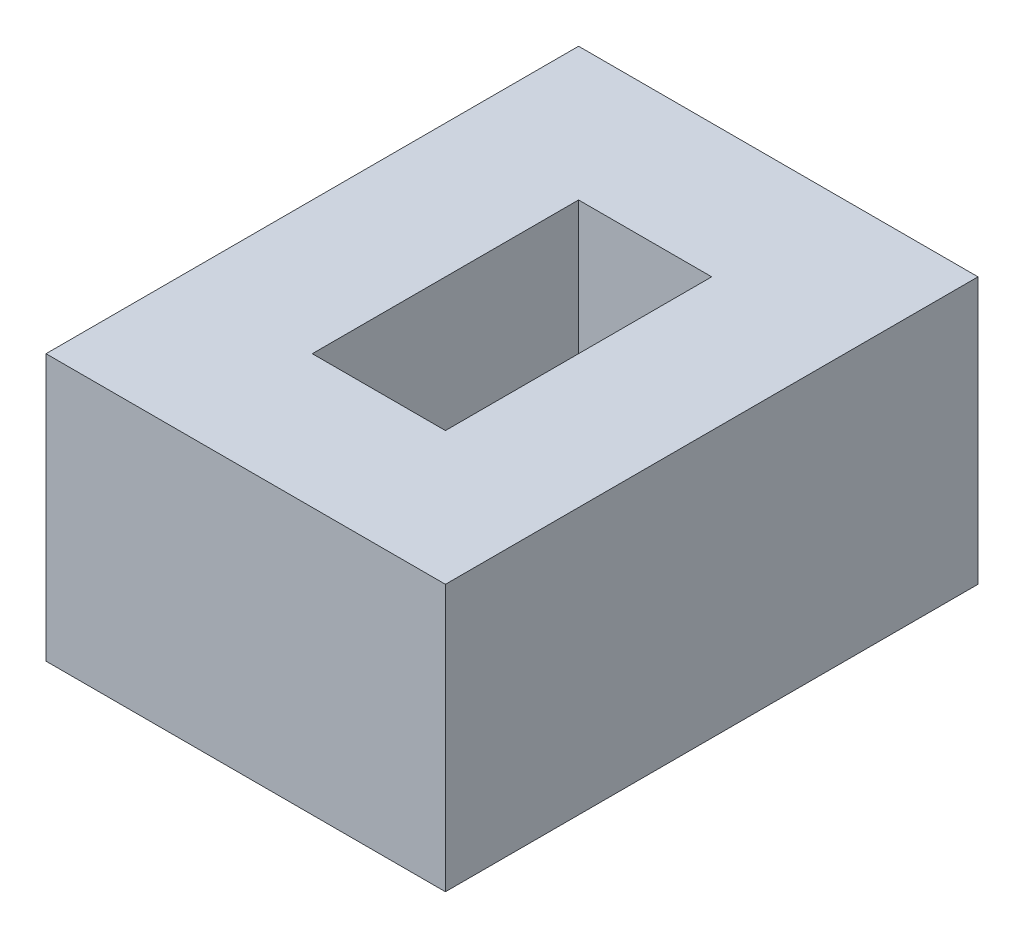
ISO-10303-21;
HEADER;
FILE_DESCRIPTION(('STEP AP214'),'2;1');
FILE_NAME('part.step','',(''),(''),'','','');
FILE_SCHEMA(('AUTOMOTIVE_DESIGN { 1 0 10303 214 1 1 1 1 }'));
ENDSEC;
DATA;
#1=APPLICATION_CONTEXT('core data for automotive mechanical design processes');
#2=APPLICATION_PROTOCOL_DEFINITION('international standard','automotive_design',2000,#1);
#3=PRODUCT_CONTEXT('',#1,'mechanical');
#4=PRODUCT('Part','Part','',(#3));
#5=PRODUCT_RELATED_PRODUCT_CATEGORY('part','',(#4));
#6=PRODUCT_DEFINITION_FORMATION('','',#4);
#7=PRODUCT_DEFINITION_CONTEXT('part definition',#1,'design');
#8=PRODUCT_DEFINITION('design','',#6,#7);
#9=PRODUCT_DEFINITION_SHAPE('','',#8);
#10=(LENGTH_UNIT() NAMED_UNIT(*) SI_UNIT(.MILLI.,.METRE.));
#11=(NAMED_UNIT(*) PLANE_ANGLE_UNIT() SI_UNIT($,.RADIAN.));
#12=(NAMED_UNIT(*) SI_UNIT($,.STERADIAN.) SOLID_ANGLE_UNIT());
#13=UNCERTAINTY_MEASURE_WITH_UNIT(LENGTH_MEASURE(1.E-05),#10,'distance_accuracy_value','');
#14=(GEOMETRIC_REPRESENTATION_CONTEXT(3) GLOBAL_UNCERTAINTY_ASSIGNED_CONTEXT((#13)) GLOBAL_UNIT_ASSIGNED_CONTEXT((#10,
#11,#12)) REPRESENTATION_CONTEXT('',''));
#15=CARTESIAN_POINT('',(0.,0.,0.));
#16=DIRECTION('',(0.,0.,1.));
#17=DIRECTION('',(1.,0.,0.));
#18=AXIS2_PLACEMENT_3D('',#15,#16,#17);
#19=CARTESIAN_POINT('',(0.,10.,0.));
#20=DIRECTION('',(0.,-1.,0.));
#21=DIRECTION('',(0.,0.,-1.));
#22=AXIS2_PLACEMENT_3D('',#19,#20,#21);
#23=PLANE('',#22);
#24=DIRECTION('',(-1.,0.,0.));
#25=VECTOR('',#24,1.);
#26=CARTESIAN_POINT('',(-5.,10.,-5.));
#27=LINE('',#26,#25);
#28=CARTESIAN_POINT('',(10.,10.,-5.));
#29=VERTEX_POINT('',#28);
#30=CARTESIAN_POINT('',(-5.,10.,-5.));
#31=VERTEX_POINT('',#30);
#32=EDGE_CURVE('E136',#29,#31,#27,.T.);
#33=ORIENTED_EDGE('',*,*,#32,.T.);
#34=DIRECTION('',(0.,0.,1.));
#35=VECTOR('',#34,1.);
#36=CARTESIAN_POINT('',(-5.,10.,-5.));
#37=LINE('',#36,#35);
#38=CARTESIAN_POINT('',(-5.,10.,15.));
#39=VERTEX_POINT('',#38);
#40=EDGE_CURVE('E139',#31,#39,#37,.T.);
#41=ORIENTED_EDGE('',*,*,#40,.T.);
#42=DIRECTION('',(1.,0.,0.));
#43=VECTOR('',#42,1.);
#44=CARTESIAN_POINT('',(-5.,10.,15.));
#45=LINE('',#44,#43);
#46=CARTESIAN_POINT('',(10.,10.,15.));
#47=VERTEX_POINT('',#46);
#48=EDGE_CURVE('E142',#39,#47,#45,.T.);
#49=ORIENTED_EDGE('',*,*,#48,.T.);
#50=DIRECTION('',(0.,0.,-1.));
#51=VECTOR('',#50,1.);
#52=CARTESIAN_POINT('',(10.,10.,-5.));
#53=LINE('',#52,#51);
#54=EDGE_CURVE('E144',#47,#29,#53,.T.);
#55=ORIENTED_EDGE('',*,*,#54,.T.);
#56=EDGE_LOOP('',(#33,#41,#49,#55));
#57=FACE_BOUND('',#56,.T.);
#58=DIRECTION('',(0.,0.,1.));
#59=VECTOR('',#58,1.);
#60=CARTESIAN_POINT('',(0.,10.,0.));
#61=LINE('',#60,#59);
#62=CARTESIAN_POINT('',(0.,10.,0.));
#63=VERTEX_POINT('',#62);
#64=CARTESIAN_POINT('',(0.,10.,10.));
#65=VERTEX_POINT('',#64);
#66=EDGE_CURVE('E100',#63,#65,#61,.T.);
#67=ORIENTED_EDGE('',*,*,#66,.F.);
#68=DIRECTION('',(-1.,0.,0.));
#69=VECTOR('',#68,1.);
#70=CARTESIAN_POINT('',(0.,10.,0.));
#71=LINE('',#70,#69);
#72=CARTESIAN_POINT('',(5.,10.,0.));
#73=VERTEX_POINT('',#72);
#74=EDGE_CURVE('E122',#73,#63,#71,.T.);
#75=ORIENTED_EDGE('',*,*,#74,.F.);
#76=DIRECTION('',(0.,0.,-1.));
#77=VECTOR('',#76,1.);
#78=CARTESIAN_POINT('',(5.,10.,0.));
#79=LINE('',#78,#77);
#80=CARTESIAN_POINT('',(5.,10.,10.));
#81=VERTEX_POINT('',#80);
#82=EDGE_CURVE('E120',#81,#73,#79,.T.);
#83=ORIENTED_EDGE('',*,*,#82,.F.);
#84=DIRECTION('',(1.,0.,0.));
#85=VECTOR('',#84,1.);
#86=CARTESIAN_POINT('',(0.,10.,10.));
#87=LINE('',#86,#85);
#88=EDGE_CURVE('E108',#65,#81,#87,.T.);
#89=ORIENTED_EDGE('',*,*,#88,.F.);
#90=EDGE_LOOP('',(#67,#75,#83,#89));
#91=FACE_BOUND('',#90,.T.);
#92=ADVANCED_FACE('F35',(#57,#91),#23,.F.);
#93=CARTESIAN_POINT('',(0.,0.,0.));
#94=DIRECTION('',(0.,-1.,0.));
#95=DIRECTION('',(0.,0.,-1.));
#96=AXIS2_PLACEMENT_3D('',#93,#94,#95);
#97=PLANE('',#96);
#98=DIRECTION('',(-1.,0.,0.));
#99=VECTOR('',#98,1.);
#100=CARTESIAN_POINT('',(-5.,0.,-5.));
#101=LINE('',#100,#99);
#102=CARTESIAN_POINT('',(10.,0.,-5.));
#103=VERTEX_POINT('',#102);
#104=CARTESIAN_POINT('',(-5.,0.,-5.));
#105=VERTEX_POINT('',#104);
#106=EDGE_CURVE('E116',#103,#105,#101,.T.);
#107=ORIENTED_EDGE('',*,*,#106,.F.);
#108=DIRECTION('',(0.,0.,-1.));
#109=VECTOR('',#108,1.);
#110=CARTESIAN_POINT('',(10.,0.,-5.));
#111=LINE('',#110,#109);
#112=CARTESIAN_POINT('',(10.,0.,15.));
#113=VERTEX_POINT('',#112);
#114=EDGE_CURVE('E140',#113,#103,#111,.T.);
#115=ORIENTED_EDGE('',*,*,#114,.F.);
#116=DIRECTION('',(1.,0.,0.));
#117=VECTOR('',#116,1.);
#118=CARTESIAN_POINT('',(-5.,0.,15.));
#119=LINE('',#118,#117);
#120=CARTESIAN_POINT('',(-5.,0.,15.));
#121=VERTEX_POINT('',#120);
#122=EDGE_CURVE('E151',#121,#113,#119,.T.);
#123=ORIENTED_EDGE('',*,*,#122,.F.);
#124=DIRECTION('',(0.,0.,1.));
#125=VECTOR('',#124,1.);
#126=CARTESIAN_POINT('',(-5.,0.,-5.));
#127=LINE('',#126,#125);
#128=EDGE_CURVE('E149',#105,#121,#127,.T.);
#129=ORIENTED_EDGE('',*,*,#128,.F.);
#130=EDGE_LOOP('',(#107,#115,#123,#129));
#131=FACE_BOUND('',#130,.T.);
#132=DIRECTION('',(-1.,0.,0.));
#133=VECTOR('',#132,1.);
#134=CARTESIAN_POINT('',(0.,0.,0.));
#135=LINE('',#134,#133);
#136=CARTESIAN_POINT('',(5.,0.,0.));
#137=VERTEX_POINT('',#136);
#138=CARTESIAN_POINT('',(0.,0.,0.));
#139=VERTEX_POINT('',#138);
#140=EDGE_CURVE('E109',#137,#139,#135,.T.);
#141=ORIENTED_EDGE('',*,*,#140,.T.);
#142=DIRECTION('',(0.,0.,1.));
#143=VECTOR('',#142,1.);
#144=CARTESIAN_POINT('',(0.,0.,0.));
#145=LINE('',#144,#143);
#146=CARTESIAN_POINT('',(0.,0.,10.));
#147=VERTEX_POINT('',#146);
#148=EDGE_CURVE('E58',#139,#147,#145,.T.);
#149=ORIENTED_EDGE('',*,*,#148,.T.);
#150=DIRECTION('',(1.,0.,0.));
#151=VECTOR('',#150,1.);
#152=CARTESIAN_POINT('',(0.,0.,10.));
#153=LINE('',#152,#151);
#154=CARTESIAN_POINT('',(5.,0.,10.));
#155=VERTEX_POINT('',#154);
#156=EDGE_CURVE('E115',#147,#155,#153,.T.);
#157=ORIENTED_EDGE('',*,*,#156,.T.);
#158=DIRECTION('',(0.,0.,-1.));
#159=VECTOR('',#158,1.);
#160=CARTESIAN_POINT('',(5.,0.,0.));
#161=LINE('',#160,#159);
#162=EDGE_CURVE('E128',#155,#137,#161,.T.);
#163=ORIENTED_EDGE('',*,*,#162,.T.);
#164=EDGE_LOOP('',(#141,#149,#157,#163));
#165=FACE_BOUND('',#164,.T.);
#166=ADVANCED_FACE('F169',(#131,#165),#97,.T.);
#167=CARTESIAN_POINT('',(-5.,10.,-5.));
#168=DIRECTION('',(0.,0.,1.));
#169=DIRECTION('',(1.,0.,0.));
#170=AXIS2_PLACEMENT_3D('',#167,#168,#169);
#171=PLANE('',#170);
#172=ORIENTED_EDGE('',*,*,#106,.T.);
#173=DIRECTION('',(0.,-1.,0.));
#174=VECTOR('',#173,1.);
#175=CARTESIAN_POINT('',(-5.,10.,-5.));
#176=LINE('',#175,#174);
#177=EDGE_CURVE('E11',#31,#105,#176,.T.);
#178=ORIENTED_EDGE('',*,*,#177,.F.);
#179=ORIENTED_EDGE('',*,*,#32,.F.);
#180=DIRECTION('',(0.,-1.,0.));
#181=VECTOR('',#180,1.);
#182=CARTESIAN_POINT('',(10.,10.,-5.));
#183=LINE('',#182,#181);
#184=EDGE_CURVE('E146',#29,#103,#183,.T.);
#185=ORIENTED_EDGE('',*,*,#184,.T.);
#186=EDGE_LOOP('',(#172,#178,#179,#185));
#187=FACE_BOUND('',#186,.T.);
#188=ADVANCED_FACE('F37',(#187),#171,.F.);
#189=CARTESIAN_POINT('',(-5.,10.,-5.));
#190=DIRECTION('',(1.,0.,0.));
#191=DIRECTION('',(0.,0.,-1.));
#192=AXIS2_PLACEMENT_3D('',#189,#190,#191);
#193=PLANE('',#192);
#194=ORIENTED_EDGE('',*,*,#128,.T.);
#195=DIRECTION('',(0.,-1.,0.));
#196=VECTOR('',#195,1.);
#197=CARTESIAN_POINT('',(-5.,10.,15.));
#198=LINE('',#197,#196);
#199=EDGE_CURVE('E43',#39,#121,#198,.T.);
#200=ORIENTED_EDGE('',*,*,#199,.F.);
#201=ORIENTED_EDGE('',*,*,#40,.F.);
#202=ORIENTED_EDGE('',*,*,#177,.T.);
#203=EDGE_LOOP('',(#194,#200,#201,#202));
#204=FACE_BOUND('',#203,.T.);
#205=ADVANCED_FACE('F179',(#204),#193,.F.);
#206=CARTESIAN_POINT('',(-5.,10.,15.));
#207=DIRECTION('',(0.,0.,-1.));
#208=DIRECTION('',(-1.,0.,0.));
#209=AXIS2_PLACEMENT_3D('',#206,#207,#208);
#210=PLANE('',#209);
#211=ORIENTED_EDGE('',*,*,#122,.T.);
#212=DIRECTION('',(0.,-1.,0.));
#213=VECTOR('',#212,1.);
#214=CARTESIAN_POINT('',(10.,10.,15.));
#215=LINE('',#214,#213);
#216=EDGE_CURVE('E156',#47,#113,#215,.T.);
#217=ORIENTED_EDGE('',*,*,#216,.F.);
#218=ORIENTED_EDGE('',*,*,#48,.F.);
#219=ORIENTED_EDGE('',*,*,#199,.T.);
#220=EDGE_LOOP('',(#211,#217,#218,#219));
#221=FACE_BOUND('',#220,.T.);
#222=ADVANCED_FACE('F163',(#221),#210,.F.);
#223=CARTESIAN_POINT('',(10.,10.,-5.));
#224=DIRECTION('',(-1.,0.,0.));
#225=DIRECTION('',(0.,0.,1.));
#226=AXIS2_PLACEMENT_3D('',#223,#224,#225);
#227=PLANE('',#226);
#228=ORIENTED_EDGE('',*,*,#114,.T.);
#229=ORIENTED_EDGE('',*,*,#184,.F.);
#230=ORIENTED_EDGE('',*,*,#54,.F.);
#231=ORIENTED_EDGE('',*,*,#216,.T.);
#232=EDGE_LOOP('',(#228,#229,#230,#231));
#233=FACE_BOUND('',#232,.T.);
#234=ADVANCED_FACE('F173',(#233),#227,.F.);
#235=CARTESIAN_POINT('',(0.,10.,0.));
#236=DIRECTION('',(1.,0.,0.));
#237=DIRECTION('',(0.,0.,-1.));
#238=AXIS2_PLACEMENT_3D('',#235,#236,#237);
#239=PLANE('',#238);
#240=ORIENTED_EDGE('',*,*,#148,.F.);
#241=DIRECTION('',(0.,-1.,0.));
#242=VECTOR('',#241,1.);
#243=CARTESIAN_POINT('',(0.,10.,0.));
#244=LINE('',#243,#242);
#245=EDGE_CURVE('E104',#63,#139,#244,.T.);
#246=ORIENTED_EDGE('',*,*,#245,.F.);
#247=ORIENTED_EDGE('',*,*,#66,.T.);
#248=DIRECTION('',(0.,-1.,0.));
#249=VECTOR('',#248,1.);
#250=CARTESIAN_POINT('',(0.,10.,10.));
#251=LINE('',#250,#249);
#252=EDGE_CURVE('E103',#65,#147,#251,.T.);
#253=ORIENTED_EDGE('',*,*,#252,.T.);
#254=EDGE_LOOP('',(#240,#246,#247,#253));
#255=FACE_BOUND('',#254,.T.);
#256=ADVANCED_FACE('F102',(#255),#239,.T.);
#257=CARTESIAN_POINT('',(0.,10.,10.));
#258=DIRECTION('',(0.,0.,-1.));
#259=DIRECTION('',(-1.,0.,0.));
#260=AXIS2_PLACEMENT_3D('',#257,#258,#259);
#261=PLANE('',#260);
#262=ORIENTED_EDGE('',*,*,#156,.F.);
#263=ORIENTED_EDGE('',*,*,#252,.F.);
#264=ORIENTED_EDGE('',*,*,#88,.T.);
#265=DIRECTION('',(0.,-1.,0.));
#266=VECTOR('',#265,1.);
#267=CARTESIAN_POINT('',(5.,10.,10.));
#268=LINE('',#267,#266);
#269=EDGE_CURVE('E117',#81,#155,#268,.T.);
#270=ORIENTED_EDGE('',*,*,#269,.T.);
#271=EDGE_LOOP('',(#262,#263,#264,#270));
#272=FACE_BOUND('',#271,.T.);
#273=ADVANCED_FACE('F112',(#272),#261,.T.);
#274=CARTESIAN_POINT('',(5.,10.,0.));
#275=DIRECTION('',(-1.,0.,0.));
#276=DIRECTION('',(0.,0.,1.));
#277=AXIS2_PLACEMENT_3D('',#274,#275,#276);
#278=PLANE('',#277);
#279=ORIENTED_EDGE('',*,*,#162,.F.);
#280=ORIENTED_EDGE('',*,*,#269,.F.);
#281=ORIENTED_EDGE('',*,*,#82,.T.);
#282=DIRECTION('',(0.,-1.,0.));
#283=VECTOR('',#282,1.);
#284=CARTESIAN_POINT('',(5.,10.,0.));
#285=LINE('',#284,#283);
#286=EDGE_CURVE('E50',#73,#137,#285,.T.);
#287=ORIENTED_EDGE('',*,*,#286,.T.);
#288=EDGE_LOOP('',(#279,#280,#281,#287));
#289=FACE_BOUND('',#288,.T.);
#290=ADVANCED_FACE('F202',(#289),#278,.T.);
#291=CARTESIAN_POINT('',(0.,10.,0.));
#292=DIRECTION('',(0.,0.,1.));
#293=DIRECTION('',(1.,0.,0.));
#294=AXIS2_PLACEMENT_3D('',#291,#292,#293);
#295=PLANE('',#294);
#296=ORIENTED_EDGE('',*,*,#140,.F.);
#297=ORIENTED_EDGE('',*,*,#286,.F.);
#298=ORIENTED_EDGE('',*,*,#74,.T.);
#299=ORIENTED_EDGE('',*,*,#245,.T.);
#300=EDGE_LOOP('',(#296,#297,#298,#299));
#301=FACE_BOUND('',#300,.T.);
#302=ADVANCED_FACE('F206',(#301),#295,.T.);
#303=CLOSED_SHELL('',(#92,#166,#188,#205,#222,#234,#256,#273,#290,#302));
#304=MANIFOLD_SOLID_BREP('B2',#303);
#305=ADVANCED_BREP_SHAPE_REPRESENTATION('',(#18,#304),#14);
#306=SHAPE_DEFINITION_REPRESENTATION(#9,#305);
ENDSEC;
END-ISO-10303-21;
